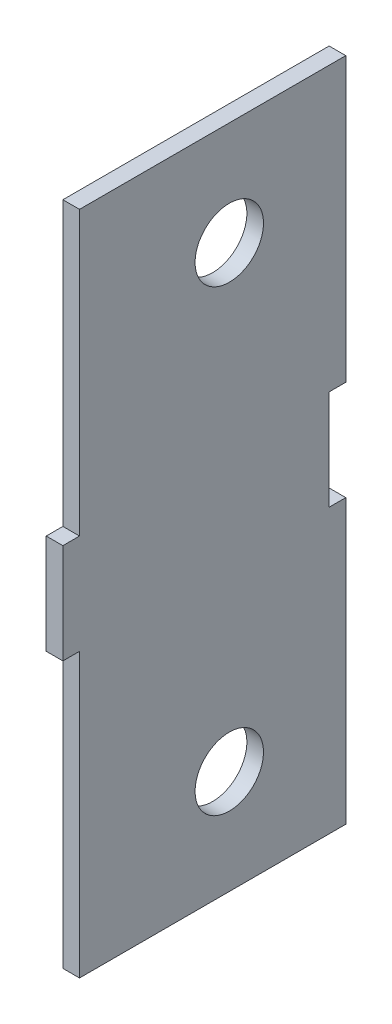
ISO-10303-21;
HEADER;
FILE_DESCRIPTION(('STEP AP214'),'2;1');
FILE_NAME('part.step','',(''),(''),'','','');
FILE_SCHEMA(('AUTOMOTIVE_DESIGN { 1 0 10303 214 1 1 1 1 }'));
ENDSEC;
DATA;
#1=APPLICATION_CONTEXT('core data for automotive mechanical design processes');
#2=APPLICATION_PROTOCOL_DEFINITION('international standard','automotive_design',2000,#1);
#3=PRODUCT_CONTEXT('',#1,'mechanical');
#4=PRODUCT('Part','Part','',(#3));
#5=PRODUCT_RELATED_PRODUCT_CATEGORY('part','',(#4));
#6=PRODUCT_DEFINITION_FORMATION('','',#4);
#7=PRODUCT_DEFINITION_CONTEXT('part definition',#1,'design');
#8=PRODUCT_DEFINITION('design','',#6,#7);
#9=PRODUCT_DEFINITION_SHAPE('','',#8);
#10=(LENGTH_UNIT() NAMED_UNIT(*) SI_UNIT(.MILLI.,.METRE.));
#11=(NAMED_UNIT(*) PLANE_ANGLE_UNIT() SI_UNIT($,.RADIAN.));
#12=(NAMED_UNIT(*) SI_UNIT($,.STERADIAN.) SOLID_ANGLE_UNIT());
#13=UNCERTAINTY_MEASURE_WITH_UNIT(LENGTH_MEASURE(1.E-05),#10,'distance_accuracy_value','');
#14=(GEOMETRIC_REPRESENTATION_CONTEXT(3) GLOBAL_UNCERTAINTY_ASSIGNED_CONTEXT((#13)) GLOBAL_UNIT_ASSIGNED_CONTEXT((#10,
#11,#12)) REPRESENTATION_CONTEXT('',''));
#15=CARTESIAN_POINT('',(0.,0.,0.));
#16=DIRECTION('',(0.,0.,1.));
#17=DIRECTION('',(1.,0.,0.));
#18=AXIS2_PLACEMENT_3D('',#15,#16,#17);
#19=CARTESIAN_POINT('',(1.5875,0.,0.));
#20=DIRECTION('',(-1.,0.,0.));
#21=DIRECTION('',(0.,0.,-1.));
#22=AXIS2_PLACEMENT_3D('',#19,#20,#21);
#23=PLANE('',#22);
#24=CARTESIAN_POINT('',(1.5875,-21.844,-1.58750000000008));
#25=DIRECTION('',(-1.,0.,0.));
#26=DIRECTION('',(0.,0.,1.));
#27=AXIS2_PLACEMENT_3D('',#24,#25,#26);
#28=CIRCLE('',#27,3.2639);
#29=CARTESIAN_POINT('',(1.5875,-21.844,1.67639999999992));
#30=VERTEX_POINT('',#29);
#31=EDGE_CURVE('E188',#30,#30,#28,.T.);
#32=ORIENTED_EDGE('',*,*,#31,.T.);
#33=EDGE_LOOP('',(#32));
#34=FACE_BOUND('',#33,.T.);
#35=CARTESIAN_POINT('',(1.5875,21.844,-1.58749999999993));
#36=DIRECTION('',(-1.,0.,0.));
#37=DIRECTION('',(0.,0.,1.));
#38=AXIS2_PLACEMENT_3D('',#35,#36,#37);
#39=CIRCLE('',#38,3.2639);
#40=CARTESIAN_POINT('',(1.5875,21.844,1.67640000000007));
#41=VERTEX_POINT('',#40);
#42=EDGE_CURVE('E194',#41,#41,#39,.T.);
#43=ORIENTED_EDGE('',*,*,#42,.T.);
#44=EDGE_LOOP('',(#43));
#45=FACE_BOUND('',#44,.T.);
#46=DIRECTION('',(0.,0.,1.));
#47=VECTOR('',#46,1.);
#48=CARTESIAN_POINT('',(1.5875,4.7625,-12.7));
#49=LINE('',#48,#47);
#50=CARTESIAN_POINT('',(1.5875,4.7625,-12.7));
#51=VERTEX_POINT('',#50);
#52=CARTESIAN_POINT('',(1.5875,4.7625,-11.1125));
#53=VERTEX_POINT('',#52);
#54=EDGE_CURVE('E149',#51,#53,#49,.T.);
#55=ORIENTED_EDGE('',*,*,#54,.F.);
#56=DIRECTION('',(0.,-1.,0.));
#57=VECTOR('',#56,1.);
#58=CARTESIAN_POINT('',(1.5875,-31.75,-12.7));
#59=LINE('',#58,#57);
#60=CARTESIAN_POINT('',(1.5875,31.75,-12.7));
#61=VERTEX_POINT('',#60);
#62=EDGE_CURVE('E207',#61,#51,#59,.T.);
#63=ORIENTED_EDGE('',*,*,#62,.F.);
#64=DIRECTION('',(0.,0.,-1.));
#65=VECTOR('',#64,1.);
#66=CARTESIAN_POINT('',(1.5875,31.75,-12.7));
#67=LINE('',#66,#65);
#68=CARTESIAN_POINT('',(1.5875,31.75,12.7));
#69=VERTEX_POINT('',#68);
#70=EDGE_CURVE('E202',#69,#61,#67,.T.);
#71=ORIENTED_EDGE('',*,*,#70,.F.);
#72=DIRECTION('',(0.,1.,0.));
#73=VECTOR('',#72,1.);
#74=CARTESIAN_POINT('',(1.5875,-31.75,12.7));
#75=LINE('',#74,#73);
#76=CARTESIAN_POINT('',(1.5875,4.7625,12.7));
#77=VERTEX_POINT('',#76);
#78=EDGE_CURVE('E203',#77,#69,#75,.T.);
#79=ORIENTED_EDGE('',*,*,#78,.F.);
#80=DIRECTION('',(0.,0.,1.));
#81=VECTOR('',#80,1.);
#82=CARTESIAN_POINT('',(1.5875,4.7625,12.7));
#83=LINE('',#82,#81);
#84=CARTESIAN_POINT('',(1.5875,4.7625,14.2875));
#85=VERTEX_POINT('',#84);
#86=EDGE_CURVE('E168',#77,#85,#83,.T.);
#87=ORIENTED_EDGE('',*,*,#86,.T.);
#88=DIRECTION('',(0.,-1.,0.));
#89=VECTOR('',#88,1.);
#90=CARTESIAN_POINT('',(1.5875,4.7625,14.2875));
#91=LINE('',#90,#89);
#92=CARTESIAN_POINT('',(1.5875,-4.7625,14.2875));
#93=VERTEX_POINT('',#92);
#94=EDGE_CURVE('E176',#85,#93,#91,.T.);
#95=ORIENTED_EDGE('',*,*,#94,.T.);
#96=DIRECTION('',(0.,0.,1.));
#97=VECTOR('',#96,1.);
#98=CARTESIAN_POINT('',(1.5875,-4.7625,12.7));
#99=LINE('',#98,#97);
#100=CARTESIAN_POINT('',(1.5875,-4.7625,12.7));
#101=VERTEX_POINT('',#100);
#102=EDGE_CURVE('E163',#101,#93,#99,.T.);
#103=ORIENTED_EDGE('',*,*,#102,.F.);
#104=CARTESIAN_POINT('',(1.5875,-31.75,12.7));
#105=VERTEX_POINT('',#104);
#106=EDGE_CURVE('E200',#105,#101,#75,.T.);
#107=ORIENTED_EDGE('',*,*,#106,.F.);
#108=DIRECTION('',(0.,0.,1.));
#109=VECTOR('',#108,1.);
#110=CARTESIAN_POINT('',(1.5875,-31.75,-12.7));
#111=LINE('',#110,#109);
#112=CARTESIAN_POINT('',(1.5875,-31.75,-12.7));
#113=VERTEX_POINT('',#112);
#114=EDGE_CURVE('E209',#113,#105,#111,.T.);
#115=ORIENTED_EDGE('',*,*,#114,.F.);
#116=CARTESIAN_POINT('',(1.5875,-4.7625,-12.7));
#117=VERTEX_POINT('',#116);
#118=EDGE_CURVE('E206',#117,#113,#59,.T.);
#119=ORIENTED_EDGE('',*,*,#118,.F.);
#120=DIRECTION('',(0.,0.,1.));
#121=VECTOR('',#120,1.);
#122=CARTESIAN_POINT('',(1.5875,-4.7625,-12.7));
#123=LINE('',#122,#121);
#124=CARTESIAN_POINT('',(1.5875,-4.7625,-11.1125));
#125=VERTEX_POINT('',#124);
#126=EDGE_CURVE('E151',#117,#125,#123,.T.);
#127=ORIENTED_EDGE('',*,*,#126,.T.);
#128=DIRECTION('',(0.,-1.,0.));
#129=VECTOR('',#128,1.);
#130=CARTESIAN_POINT('',(1.5875,4.7625,-11.1125));
#131=LINE('',#130,#129);
#132=EDGE_CURVE('E136',#53,#125,#131,.T.);
#133=ORIENTED_EDGE('',*,*,#132,.F.);
#134=EDGE_LOOP('',(#55,#63,#71,#79,#87,#95,#103,#107,#115,#119,#127,#133));
#135=FACE_BOUND('',#134,.T.);
#136=ADVANCED_FACE('F43',(#34,#45,#135),#23,.F.);
#137=CARTESIAN_POINT('',(0.,0.,0.));
#138=DIRECTION('',(-1.,0.,0.));
#139=DIRECTION('',(0.,0.,-1.));
#140=AXIS2_PLACEMENT_3D('',#137,#138,#139);
#141=PLANE('',#140);
#142=CARTESIAN_POINT('',(0.,21.844,-1.58749999999993));
#143=DIRECTION('',(-1.,0.,0.));
#144=DIRECTION('',(0.,0.,1.));
#145=AXIS2_PLACEMENT_3D('',#142,#143,#144);
#146=CIRCLE('',#145,3.2639);
#147=CARTESIAN_POINT('',(0.,21.844,1.67640000000007));
#148=VERTEX_POINT('',#147);
#149=EDGE_CURVE('E191',#148,#148,#146,.T.);
#150=ORIENTED_EDGE('',*,*,#149,.F.);
#151=EDGE_LOOP('',(#150));
#152=FACE_BOUND('',#151,.T.);
#153=CARTESIAN_POINT('',(0.,-21.844,-1.58750000000008));
#154=DIRECTION('',(-1.,0.,0.));
#155=DIRECTION('',(0.,0.,1.));
#156=AXIS2_PLACEMENT_3D('',#153,#154,#155);
#157=CIRCLE('',#156,3.2639);
#158=CARTESIAN_POINT('',(0.,-21.844,1.67639999999992));
#159=VERTEX_POINT('',#158);
#160=EDGE_CURVE('E182',#159,#159,#157,.T.);
#161=ORIENTED_EDGE('',*,*,#160,.F.);
#162=EDGE_LOOP('',(#161));
#163=FACE_BOUND('',#162,.T.);
#164=DIRECTION('',(0.,1.,0.));
#165=VECTOR('',#164,1.);
#166=CARTESIAN_POINT('',(0.,0.,-11.1125));
#167=LINE('',#166,#165);
#168=CARTESIAN_POINT('',(0.,-4.7625,-11.1125));
#169=VERTEX_POINT('',#168);
#170=CARTESIAN_POINT('',(0.,4.7625,-11.1125));
#171=VERTEX_POINT('',#170);
#172=EDGE_CURVE('E11',#169,#171,#167,.T.);
#173=ORIENTED_EDGE('',*,*,#172,.F.);
#174=DIRECTION('',(0.,0.,-1.));
#175=VECTOR('',#174,1.);
#176=CARTESIAN_POINT('',(0.,-4.76249999999999,0.));
#177=LINE('',#176,#175);
#178=CARTESIAN_POINT('',(0.,-4.7625,-12.7));
#179=VERTEX_POINT('',#178);
#180=EDGE_CURVE('E143',#169,#179,#177,.T.);
#181=ORIENTED_EDGE('',*,*,#180,.T.);
#182=DIRECTION('',(0.,-1.,0.));
#183=VECTOR('',#182,1.);
#184=CARTESIAN_POINT('',(0.,-31.75,-12.7));
#185=LINE('',#184,#183);
#186=CARTESIAN_POINT('',(0.,-31.75,-12.7));
#187=VERTEX_POINT('',#186);
#188=EDGE_CURVE('E219',#179,#187,#185,.T.);
#189=ORIENTED_EDGE('',*,*,#188,.T.);
#190=DIRECTION('',(0.,0.,1.));
#191=VECTOR('',#190,1.);
#192=CARTESIAN_POINT('',(0.,-31.75,-12.7));
#193=LINE('',#192,#191);
#194=CARTESIAN_POINT('',(0.,-31.75,12.7));
#195=VERTEX_POINT('',#194);
#196=EDGE_CURVE('E223',#187,#195,#193,.T.);
#197=ORIENTED_EDGE('',*,*,#196,.T.);
#198=DIRECTION('',(0.,1.,0.));
#199=VECTOR('',#198,1.);
#200=CARTESIAN_POINT('',(0.,-31.75,12.7));
#201=LINE('',#200,#199);
#202=CARTESIAN_POINT('',(0.,-4.7625,12.7));
#203=VERTEX_POINT('',#202);
#204=EDGE_CURVE('E213',#195,#203,#201,.T.);
#205=ORIENTED_EDGE('',*,*,#204,.T.);
#206=DIRECTION('',(0.,0.,1.));
#207=VECTOR('',#206,1.);
#208=CARTESIAN_POINT('',(0.,-4.7625,12.7));
#209=LINE('',#208,#207);
#210=CARTESIAN_POINT('',(0.,-4.7625,14.2875));
#211=VERTEX_POINT('',#210);
#212=EDGE_CURVE('E164',#203,#211,#209,.T.);
#213=ORIENTED_EDGE('',*,*,#212,.T.);
#214=DIRECTION('',(0.,-1.,0.));
#215=VECTOR('',#214,1.);
#216=CARTESIAN_POINT('',(0.,4.7625,14.2875));
#217=LINE('',#216,#215);
#218=CARTESIAN_POINT('',(0.,4.7625,14.2875));
#219=VERTEX_POINT('',#218);
#220=EDGE_CURVE('E167',#219,#211,#217,.T.);
#221=ORIENTED_EDGE('',*,*,#220,.F.);
#222=DIRECTION('',(0.,0.,1.));
#223=VECTOR('',#222,1.);
#224=CARTESIAN_POINT('',(0.,4.7625,12.7));
#225=LINE('',#224,#223);
#226=CARTESIAN_POINT('',(0.,4.7625,12.7));
#227=VERTEX_POINT('',#226);
#228=EDGE_CURVE('E171',#227,#219,#225,.T.);
#229=ORIENTED_EDGE('',*,*,#228,.F.);
#230=CARTESIAN_POINT('',(0.,31.75,12.7));
#231=VERTEX_POINT('',#230);
#232=EDGE_CURVE('E197',#227,#231,#201,.T.);
#233=ORIENTED_EDGE('',*,*,#232,.T.);
#234=DIRECTION('',(0.,0.,-1.));
#235=VECTOR('',#234,1.);
#236=CARTESIAN_POINT('',(0.,31.75,-12.7));
#237=LINE('',#236,#235);
#238=CARTESIAN_POINT('',(0.,31.75,-12.7));
#239=VERTEX_POINT('',#238);
#240=EDGE_CURVE('E216',#231,#239,#237,.T.);
#241=ORIENTED_EDGE('',*,*,#240,.T.);
#242=CARTESIAN_POINT('',(0.,4.7625,-12.7));
#243=VERTEX_POINT('',#242);
#244=EDGE_CURVE('E220',#239,#243,#185,.T.);
#245=ORIENTED_EDGE('',*,*,#244,.T.);
#246=DIRECTION('',(0.,0.,-1.));
#247=VECTOR('',#246,1.);
#248=CARTESIAN_POINT('',(0.,4.7625,0.));
#249=LINE('',#248,#247);
#250=EDGE_CURVE('E161',#171,#243,#249,.T.);
#251=ORIENTED_EDGE('',*,*,#250,.F.);
#252=EDGE_LOOP('',(#173,#181,#189,#197,#205,#213,#221,#229,#233,#241,#245,#251));
#253=FACE_BOUND('',#252,.T.);
#254=ADVANCED_FACE('F237',(#152,#163,#253),#141,.T.);
#255=CARTESIAN_POINT('',(1.5875,-31.75,-12.7));
#256=DIRECTION('',(0.,0.,1.));
#257=DIRECTION('',(-1.,0.,0.));
#258=AXIS2_PLACEMENT_3D('',#255,#256,#257);
#259=PLANE('',#258);
#260=DIRECTION('',(-1.,0.,0.));
#261=VECTOR('',#260,1.);
#262=CARTESIAN_POINT('',(1.5875,4.7625,-12.7));
#263=LINE('',#262,#261);
#264=EDGE_CURVE('E51',#51,#243,#263,.T.);
#265=ORIENTED_EDGE('',*,*,#264,.T.);
#266=ORIENTED_EDGE('',*,*,#244,.F.);
#267=DIRECTION('',(-1.,0.,0.));
#268=VECTOR('',#267,1.);
#269=CARTESIAN_POINT('',(1.5875,31.75,-12.7));
#270=LINE('',#269,#268);
#271=EDGE_CURVE('E229',#61,#239,#270,.T.);
#272=ORIENTED_EDGE('',*,*,#271,.F.);
#273=ORIENTED_EDGE('',*,*,#62,.T.);
#274=EDGE_LOOP('',(#265,#266,#272,#273));
#275=FACE_BOUND('',#274,.T.);
#276=ADVANCED_FACE('F235',(#275),#259,.F.);
#277=CARTESIAN_POINT('',(1.5875,-31.75,12.7));
#278=DIRECTION('',(0.,0.,-1.));
#279=DIRECTION('',(1.,0.,0.));
#280=AXIS2_PLACEMENT_3D('',#277,#278,#279);
#281=PLANE('',#280);
#282=DIRECTION('',(1.,0.,0.));
#283=VECTOR('',#282,1.);
#284=CARTESIAN_POINT('',(0.,4.7625,12.7));
#285=LINE('',#284,#283);
#286=EDGE_CURVE('E183',#227,#77,#285,.T.);
#287=ORIENTED_EDGE('',*,*,#286,.T.);
#288=ORIENTED_EDGE('',*,*,#78,.T.);
#289=DIRECTION('',(-1.,0.,0.));
#290=VECTOR('',#289,1.);
#291=CARTESIAN_POINT('',(1.5875,31.75,12.7));
#292=LINE('',#291,#290);
#293=EDGE_CURVE('E231',#69,#231,#292,.T.);
#294=ORIENTED_EDGE('',*,*,#293,.T.);
#295=ORIENTED_EDGE('',*,*,#232,.F.);
#296=EDGE_LOOP('',(#287,#288,#294,#295));
#297=FACE_BOUND('',#296,.T.);
#298=ADVANCED_FACE('F249',(#297),#281,.F.);
#299=ORIENTED_EDGE('',*,*,#204,.F.);
#300=DIRECTION('',(-1.,0.,0.));
#301=VECTOR('',#300,1.);
#302=CARTESIAN_POINT('',(1.5875,-31.75,12.7));
#303=LINE('',#302,#301);
#304=EDGE_CURVE('E212',#105,#195,#303,.T.);
#305=ORIENTED_EDGE('',*,*,#304,.F.);
#306=ORIENTED_EDGE('',*,*,#106,.T.);
#307=DIRECTION('',(1.,0.,0.));
#308=VECTOR('',#307,1.);
#309=CARTESIAN_POINT('',(0.,-4.7625,12.7));
#310=LINE('',#309,#308);
#311=EDGE_CURVE('E66',#203,#101,#310,.T.);
#312=ORIENTED_EDGE('',*,*,#311,.F.);
#313=EDGE_LOOP('',(#299,#305,#306,#312));
#314=FACE_BOUND('',#313,.T.);
#315=ADVANCED_FACE('F45',(#314),#281,.F.);
#316=CARTESIAN_POINT('',(1.5875,31.75,-12.7));
#317=DIRECTION('',(0.,-1.,0.));
#318=DIRECTION('',(0.,0.,1.));
#319=AXIS2_PLACEMENT_3D('',#316,#317,#318);
#320=PLANE('',#319);
#321=ORIENTED_EDGE('',*,*,#240,.F.);
#322=ORIENTED_EDGE('',*,*,#293,.F.);
#323=ORIENTED_EDGE('',*,*,#70,.T.);
#324=ORIENTED_EDGE('',*,*,#271,.T.);
#325=EDGE_LOOP('',(#321,#322,#323,#324));
#326=FACE_BOUND('',#325,.T.);
#327=ADVANCED_FACE('F243',(#326),#320,.F.);
#328=ORIENTED_EDGE('',*,*,#118,.T.);
#329=DIRECTION('',(-1.,0.,0.));
#330=VECTOR('',#329,1.);
#331=CARTESIAN_POINT('',(1.5875,-31.75,-12.7));
#332=LINE('',#331,#330);
#333=EDGE_CURVE('E227',#113,#187,#332,.T.);
#334=ORIENTED_EDGE('',*,*,#333,.T.);
#335=ORIENTED_EDGE('',*,*,#188,.F.);
#336=DIRECTION('',(-1.,0.,0.));
#337=VECTOR('',#336,1.);
#338=CARTESIAN_POINT('',(1.5875,-4.7625,-12.7));
#339=LINE('',#338,#337);
#340=EDGE_CURVE('E58',#117,#179,#339,.T.);
#341=ORIENTED_EDGE('',*,*,#340,.F.);
#342=EDGE_LOOP('',(#328,#334,#335,#341));
#343=FACE_BOUND('',#342,.T.);
#344=ADVANCED_FACE('F268',(#343),#259,.F.);
#345=CARTESIAN_POINT('',(1.5875,-31.75,-12.7));
#346=DIRECTION('',(0.,1.,0.));
#347=DIRECTION('',(0.,0.,-1.));
#348=AXIS2_PLACEMENT_3D('',#345,#346,#347);
#349=PLANE('',#348);
#350=ORIENTED_EDGE('',*,*,#196,.F.);
#351=ORIENTED_EDGE('',*,*,#333,.F.);
#352=ORIENTED_EDGE('',*,*,#114,.T.);
#353=ORIENTED_EDGE('',*,*,#304,.T.);
#354=EDGE_LOOP('',(#350,#351,#352,#353));
#355=FACE_BOUND('',#354,.T.);
#356=ADVANCED_FACE('F265',(#355),#349,.F.);
#357=CARTESIAN_POINT('',(1.5875,21.844,-1.58749999999993));
#358=DIRECTION('',(-1.,0.,0.));
#359=DIRECTION('',(0.,0.,-1.));
#360=AXIS2_PLACEMENT_3D('',#357,#358,#359);
#361=CYLINDRICAL_SURFACE('',#360,3.2639);
#362=ORIENTED_EDGE('',*,*,#42,.F.);
#363=EDGE_LOOP('',(#362));
#364=FACE_BOUND('',#363,.T.);
#365=ORIENTED_EDGE('',*,*,#149,.T.);
#366=EDGE_LOOP('',(#365));
#367=FACE_BOUND('',#366,.T.);
#368=ADVANCED_FACE('F286',(#364,#367),#361,.F.);
#369=CARTESIAN_POINT('',(1.5875,-21.844,-1.58750000000008));
#370=DIRECTION('',(-1.,0.,0.));
#371=DIRECTION('',(0.,0.,-1.));
#372=AXIS2_PLACEMENT_3D('',#369,#370,#371);
#373=CYLINDRICAL_SURFACE('',#372,3.2639);
#374=ORIENTED_EDGE('',*,*,#31,.F.);
#375=EDGE_LOOP('',(#374));
#376=FACE_BOUND('',#375,.T.);
#377=ORIENTED_EDGE('',*,*,#160,.T.);
#378=EDGE_LOOP('',(#377));
#379=FACE_BOUND('',#378,.T.);
#380=ADVANCED_FACE('F364',(#376,#379),#373,.F.);
#381=CARTESIAN_POINT('',(0.,-4.7625,12.7));
#382=DIRECTION('',(0.,-1.,0.));
#383=DIRECTION('',(0.,0.,1.));
#384=AXIS2_PLACEMENT_3D('',#381,#382,#383);
#385=PLANE('',#384);
#386=ORIENTED_EDGE('',*,*,#102,.T.);
#387=DIRECTION('',(1.,0.,0.));
#388=VECTOR('',#387,1.);
#389=CARTESIAN_POINT('',(0.,-4.7625,14.2875));
#390=LINE('',#389,#388);
#391=EDGE_CURVE('E174',#211,#93,#390,.T.);
#392=ORIENTED_EDGE('',*,*,#391,.F.);
#393=ORIENTED_EDGE('',*,*,#212,.F.);
#394=ORIENTED_EDGE('',*,*,#311,.T.);
#395=EDGE_LOOP('',(#386,#392,#393,#394));
#396=FACE_BOUND('',#395,.T.);
#397=ADVANCED_FACE('F259',(#396),#385,.T.);
#398=CARTESIAN_POINT('',(0.,4.7625,12.7));
#399=DIRECTION('',(0.,-1.,0.));
#400=DIRECTION('',(0.,0.,1.));
#401=AXIS2_PLACEMENT_3D('',#398,#399,#400);
#402=PLANE('',#401);
#403=ORIENTED_EDGE('',*,*,#86,.F.);
#404=ORIENTED_EDGE('',*,*,#286,.F.);
#405=ORIENTED_EDGE('',*,*,#228,.T.);
#406=DIRECTION('',(1.,0.,0.));
#407=VECTOR('',#406,1.);
#408=CARTESIAN_POINT('',(0.,4.7625,14.2875));
#409=LINE('',#408,#407);
#410=EDGE_CURVE('E185',#219,#85,#409,.T.);
#411=ORIENTED_EDGE('',*,*,#410,.T.);
#412=EDGE_LOOP('',(#403,#404,#405,#411));
#413=FACE_BOUND('',#412,.T.);
#414=ADVANCED_FACE('F251',(#413),#402,.F.);
#415=CARTESIAN_POINT('',(0.,4.7625,14.2875));
#416=DIRECTION('',(0.,0.,-1.));
#417=DIRECTION('',(1.,0.,0.));
#418=AXIS2_PLACEMENT_3D('',#415,#416,#417);
#419=PLANE('',#418);
#420=ORIENTED_EDGE('',*,*,#94,.F.);
#421=ORIENTED_EDGE('',*,*,#410,.F.);
#422=ORIENTED_EDGE('',*,*,#220,.T.);
#423=ORIENTED_EDGE('',*,*,#391,.T.);
#424=EDGE_LOOP('',(#420,#421,#422,#423));
#425=FACE_BOUND('',#424,.T.);
#426=ADVANCED_FACE('F255',(#425),#419,.F.);
#427=CARTESIAN_POINT('',(-1.5875,4.7625,-12.7));
#428=DIRECTION('',(0.,-1.,0.));
#429=DIRECTION('',(0.,0.,1.));
#430=AXIS2_PLACEMENT_3D('',#427,#428,#429);
#431=PLANE('',#430);
#432=DIRECTION('',(1.,0.,0.));
#433=VECTOR('',#432,1.);
#434=CARTESIAN_POINT('',(-1.5875,4.7625,-11.1125));
#435=LINE('',#434,#433);
#436=EDGE_CURVE('E133',#171,#53,#435,.T.);
#437=ORIENTED_EDGE('',*,*,#436,.F.);
#438=ORIENTED_EDGE('',*,*,#250,.T.);
#439=ORIENTED_EDGE('',*,*,#264,.F.);
#440=ORIENTED_EDGE('',*,*,#54,.T.);
#441=EDGE_LOOP('',(#437,#438,#439,#440));
#442=FACE_BOUND('',#441,.T.);
#443=ADVANCED_FACE('F153',(#442),#431,.T.);
#444=CARTESIAN_POINT('',(-1.5875,4.7625,-11.1125));
#445=DIRECTION('',(0.,0.,-1.));
#446=DIRECTION('',(1.,0.,0.));
#447=AXIS2_PLACEMENT_3D('',#444,#445,#446);
#448=PLANE('',#447);
#449=DIRECTION('',(1.,0.,0.));
#450=VECTOR('',#449,1.);
#451=CARTESIAN_POINT('',(-1.5875,-4.7625,-11.1125));
#452=LINE('',#451,#450);
#453=EDGE_CURVE('E144',#169,#125,#452,.T.);
#454=ORIENTED_EDGE('',*,*,#453,.F.);
#455=ORIENTED_EDGE('',*,*,#172,.T.);
#456=ORIENTED_EDGE('',*,*,#436,.T.);
#457=ORIENTED_EDGE('',*,*,#132,.T.);
#458=EDGE_LOOP('',(#454,#455,#456,#457));
#459=FACE_BOUND('',#458,.T.);
#460=ADVANCED_FACE('F135',(#459),#448,.T.);
#461=CARTESIAN_POINT('',(-1.5875,-4.7625,-12.7));
#462=DIRECTION('',(0.,-1.,0.));
#463=DIRECTION('',(0.,0.,1.));
#464=AXIS2_PLACEMENT_3D('',#461,#462,#463);
#465=PLANE('',#464);
#466=ORIENTED_EDGE('',*,*,#180,.F.);
#467=ORIENTED_EDGE('',*,*,#453,.T.);
#468=ORIENTED_EDGE('',*,*,#126,.F.);
#469=ORIENTED_EDGE('',*,*,#340,.T.);
#470=EDGE_LOOP('',(#466,#467,#468,#469));
#471=FACE_BOUND('',#470,.T.);
#472=ADVANCED_FACE('F269',(#471),#465,.F.);
#473=CLOSED_SHELL('',(#136,#254,#276,#298,#315,#327,#344,#356,#368,#380,#397,#414,#426,#443,
#460,#472));
#474=MANIFOLD_SOLID_BREP('B2',#473);
#475=ADVANCED_BREP_SHAPE_REPRESENTATION('',(#18,#474),#14);
#476=SHAPE_DEFINITION_REPRESENTATION(#9,#475);
ENDSEC;
END-ISO-10303-21;
